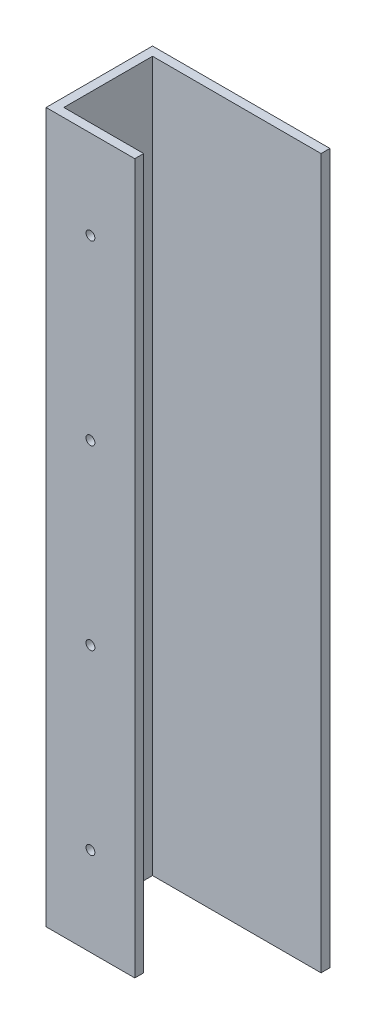
ISO-10303-21;
HEADER;
FILE_DESCRIPTION(('STEP AP214'),'2;1');
FILE_NAME('part.step','',(''),(''),'','','');
FILE_SCHEMA(('AUTOMOTIVE_DESIGN { 1 0 10303 214 1 1 1 1 }'));
ENDSEC;
DATA;
#1=APPLICATION_CONTEXT('core data for automotive mechanical design processes');
#2=APPLICATION_PROTOCOL_DEFINITION('international standard','automotive_design',2000,#1);
#3=PRODUCT_CONTEXT('',#1,'mechanical');
#4=PRODUCT('Part','Part','',(#3));
#5=PRODUCT_RELATED_PRODUCT_CATEGORY('part','',(#4));
#6=PRODUCT_DEFINITION_FORMATION('','',#4);
#7=PRODUCT_DEFINITION_CONTEXT('part definition',#1,'design');
#8=PRODUCT_DEFINITION('design','',#6,#7);
#9=PRODUCT_DEFINITION_SHAPE('','',#8);
#10=(LENGTH_UNIT() NAMED_UNIT(*) SI_UNIT(.MILLI.,.METRE.));
#11=(NAMED_UNIT(*) PLANE_ANGLE_UNIT() SI_UNIT($,.RADIAN.));
#12=(NAMED_UNIT(*) SI_UNIT($,.STERADIAN.) SOLID_ANGLE_UNIT());
#13=UNCERTAINTY_MEASURE_WITH_UNIT(LENGTH_MEASURE(1.E-05),#10,'distance_accuracy_value','');
#14=(GEOMETRIC_REPRESENTATION_CONTEXT(3) GLOBAL_UNCERTAINTY_ASSIGNED_CONTEXT((#13)) GLOBAL_UNIT_ASSIGNED_CONTEXT((#10,
#11,#12)) REPRESENTATION_CONTEXT('',''));
#15=CARTESIAN_POINT('',(0.,0.,0.));
#16=DIRECTION('',(0.,0.,1.));
#17=DIRECTION('',(1.,0.,0.));
#18=AXIS2_PLACEMENT_3D('',#15,#16,#17);
#19=CARTESIAN_POINT('',(25.,50.,55.));
#20=DIRECTION('',(0.,0.,1.));
#21=DIRECTION('',(1.,0.,0.));
#22=AXIS2_PLACEMENT_3D('',#19,#20,#21);
#23=CYLINDRICAL_SURFACE('',#22,2.5);
#24=CARTESIAN_POINT('',(25.,50.,55.));
#25=DIRECTION('',(0.,0.,1.));
#26=DIRECTION('',(1.,0.,0.));
#27=AXIS2_PLACEMENT_3D('',#24,#25,#26);
#28=CIRCLE('',#27,2.5);
#29=CARTESIAN_POINT('',(27.5,50.,55.));
#30=VERTEX_POINT('',#29);
#31=EDGE_CURVE('E20',#30,#30,#28,.T.);
#32=ORIENTED_EDGE('',*,*,#31,.F.);
#33=EDGE_LOOP('',(#32));
#34=FACE_BOUND('',#33,.T.);
#35=CARTESIAN_POINT('',(25.,50.,60.));
#36=DIRECTION('',(0.,0.,1.));
#37=DIRECTION('',(1.,0.,0.));
#38=AXIS2_PLACEMENT_3D('',#35,#36,#37);
#39=CIRCLE('',#38,2.5);
#40=CARTESIAN_POINT('',(27.5,50.,60.));
#41=VERTEX_POINT('',#40);
#42=EDGE_CURVE('E121',#41,#41,#39,.T.);
#43=ORIENTED_EDGE('',*,*,#42,.T.);
#44=EDGE_LOOP('',(#43));
#45=FACE_BOUND('',#44,.T.);
#46=ADVANCED_FACE('F17',(#34,#45),#23,.F.);
#47=CARTESIAN_POINT('',(24.9999999999997,150.,55.));
#48=DIRECTION('',(0.,0.,1.));
#49=DIRECTION('',(1.,0.,0.));
#50=AXIS2_PLACEMENT_3D('',#47,#48,#49);
#51=CYLINDRICAL_SURFACE('',#50,2.5);
#52=CARTESIAN_POINT('',(24.9999999999997,150.,55.));
#53=DIRECTION('',(0.,0.,1.));
#54=DIRECTION('',(1.,0.,0.));
#55=AXIS2_PLACEMENT_3D('',#52,#53,#54);
#56=CIRCLE('',#55,2.5);
#57=CARTESIAN_POINT('',(27.4999999999997,150.,55.));
#58=VERTEX_POINT('',#57);
#59=EDGE_CURVE('E140',#58,#58,#56,.T.);
#60=ORIENTED_EDGE('',*,*,#59,.F.);
#61=EDGE_LOOP('',(#60));
#62=FACE_BOUND('',#61,.T.);
#63=CARTESIAN_POINT('',(24.9999999999997,150.,60.));
#64=DIRECTION('',(0.,0.,1.));
#65=DIRECTION('',(1.,0.,0.));
#66=AXIS2_PLACEMENT_3D('',#63,#64,#65);
#67=CIRCLE('',#66,2.5);
#68=CARTESIAN_POINT('',(27.4999999999997,150.,60.));
#69=VERTEX_POINT('',#68);
#70=EDGE_CURVE('E131',#69,#69,#67,.T.);
#71=ORIENTED_EDGE('',*,*,#70,.T.);
#72=EDGE_LOOP('',(#71));
#73=FACE_BOUND('',#72,.T.);
#74=ADVANCED_FACE('F151',(#62,#73),#51,.F.);
#75=CARTESIAN_POINT('',(24.9999999999993,250.,55.));
#76=DIRECTION('',(0.,0.,1.));
#77=DIRECTION('',(1.,0.,0.));
#78=AXIS2_PLACEMENT_3D('',#75,#76,#77);
#79=CYLINDRICAL_SURFACE('',#78,2.5);
#80=CARTESIAN_POINT('',(24.9999999999993,250.,55.));
#81=DIRECTION('',(0.,0.,1.));
#82=DIRECTION('',(1.,0.,0.));
#83=AXIS2_PLACEMENT_3D('',#80,#81,#82);
#84=CIRCLE('',#83,2.5);
#85=CARTESIAN_POINT('',(27.4999999999993,250.,55.));
#86=VERTEX_POINT('',#85);
#87=EDGE_CURVE('E138',#86,#86,#84,.T.);
#88=ORIENTED_EDGE('',*,*,#87,.F.);
#89=EDGE_LOOP('',(#88));
#90=FACE_BOUND('',#89,.T.);
#91=CARTESIAN_POINT('',(24.9999999999993,250.,60.));
#92=DIRECTION('',(0.,0.,1.));
#93=DIRECTION('',(1.,0.,0.));
#94=AXIS2_PLACEMENT_3D('',#91,#92,#93);
#95=CIRCLE('',#94,2.5);
#96=CARTESIAN_POINT('',(27.4999999999993,250.,60.));
#97=VERTEX_POINT('',#96);
#98=EDGE_CURVE('E128',#97,#97,#95,.T.);
#99=ORIENTED_EDGE('',*,*,#98,.T.);
#100=EDGE_LOOP('',(#99));
#101=FACE_BOUND('',#100,.T.);
#102=ADVANCED_FACE('F259',(#90,#101),#79,.F.);
#103=CARTESIAN_POINT('',(24.999999999999,350.,55.));
#104=DIRECTION('',(0.,0.,1.));
#105=DIRECTION('',(1.,0.,0.));
#106=AXIS2_PLACEMENT_3D('',#103,#104,#105);
#107=CYLINDRICAL_SURFACE('',#106,2.5);
#108=CARTESIAN_POINT('',(24.999999999999,350.,55.));
#109=DIRECTION('',(0.,0.,1.));
#110=DIRECTION('',(1.,0.,0.));
#111=AXIS2_PLACEMENT_3D('',#108,#109,#110);
#112=CIRCLE('',#111,2.5);
#113=CARTESIAN_POINT('',(27.499999999999,350.,55.));
#114=VERTEX_POINT('',#113);
#115=EDGE_CURVE('E125',#114,#114,#112,.T.);
#116=ORIENTED_EDGE('',*,*,#115,.F.);
#117=EDGE_LOOP('',(#116));
#118=FACE_BOUND('',#117,.T.);
#119=CARTESIAN_POINT('',(24.999999999999,350.,60.));
#120=DIRECTION('',(0.,0.,1.));
#121=DIRECTION('',(1.,0.,0.));
#122=AXIS2_PLACEMENT_3D('',#119,#120,#121);
#123=CIRCLE('',#122,2.5);
#124=CARTESIAN_POINT('',(27.499999999999,350.,60.));
#125=VERTEX_POINT('',#124);
#126=EDGE_CURVE('E117',#125,#125,#123,.T.);
#127=ORIENTED_EDGE('',*,*,#126,.T.);
#128=EDGE_LOOP('',(#127));
#129=FACE_BOUND('',#128,.T.);
#130=ADVANCED_FACE('F250',(#118,#129),#107,.F.);
#131=CARTESIAN_POINT('',(100.,0.,55.));
#132=DIRECTION('',(0.,0.,-1.));
#133=DIRECTION('',(-1.,0.,0.));
#134=AXIS2_PLACEMENT_3D('',#131,#132,#133);
#135=PLANE('',#134);
#136=DIRECTION('',(1.,0.,0.));
#137=VECTOR('',#136,1.);
#138=CARTESIAN_POINT('',(0.,0.,55.));
#139=LINE('',#138,#137);
#140=CARTESIAN_POINT('',(50.,0.,55.));
#141=VERTEX_POINT('',#140);
#142=CARTESIAN_POINT('',(5.,0.,55.));
#143=VERTEX_POINT('',#142);
#144=EDGE_CURVE('E302',#141,#143,#139,.F.);
#145=ORIENTED_EDGE('',*,*,#144,.T.);
#146=DIRECTION('',(0.,1.,0.));
#147=VECTOR('',#146,1.);
#148=CARTESIAN_POINT('',(5.,0.,55.));
#149=LINE('',#148,#147);
#150=CARTESIAN_POINT('',(5.,400.,55.));
#151=VERTEX_POINT('',#150);
#152=EDGE_CURVE('E122',#151,#143,#149,.F.);
#153=ORIENTED_EDGE('',*,*,#152,.F.);
#154=DIRECTION('',(1.,0.,0.));
#155=VECTOR('',#154,1.);
#156=CARTESIAN_POINT('',(0.,400.,55.));
#157=LINE('',#156,#155);
#158=CARTESIAN_POINT('',(50.,400.,55.));
#159=VERTEX_POINT('',#158);
#160=EDGE_CURVE('E323',#151,#159,#157,.T.);
#161=ORIENTED_EDGE('',*,*,#160,.T.);
#162=DIRECTION('',(0.,1.,0.));
#163=VECTOR('',#162,1.);
#164=CARTESIAN_POINT('',(50.,0.,55.));
#165=LINE('',#164,#163);
#166=EDGE_CURVE('E114',#141,#159,#165,.T.);
#167=ORIENTED_EDGE('',*,*,#166,.F.);
#168=EDGE_LOOP('',(#145,#153,#161,#167));
#169=FACE_BOUND('',#168,.T.);
#170=ORIENTED_EDGE('',*,*,#115,.T.);
#171=EDGE_LOOP('',(#170));
#172=FACE_BOUND('',#171,.T.);
#173=ORIENTED_EDGE('',*,*,#87,.T.);
#174=EDGE_LOOP('',(#173));
#175=FACE_BOUND('',#174,.T.);
#176=ORIENTED_EDGE('',*,*,#59,.T.);
#177=EDGE_LOOP('',(#176));
#178=FACE_BOUND('',#177,.T.);
#179=ORIENTED_EDGE('',*,*,#31,.T.);
#180=EDGE_LOOP('',(#179));
#181=FACE_BOUND('',#180,.T.);
#182=ADVANCED_FACE('F147',(#169,#172,#175,#178,#181),#135,.T.);
#183=CARTESIAN_POINT('',(5.,0.,55.));
#184=DIRECTION('',(1.,0.,0.));
#185=DIRECTION('',(0.,0.,-1.));
#186=AXIS2_PLACEMENT_3D('',#183,#184,#185);
#187=PLANE('',#186);
#188=DIRECTION('',(0.,0.,1.));
#189=VECTOR('',#188,1.);
#190=CARTESIAN_POINT('',(5.,0.,60.));
#191=LINE('',#190,#189);
#192=CARTESIAN_POINT('',(5.,0.,5.));
#193=VERTEX_POINT('',#192);
#194=EDGE_CURVE('E307',#143,#193,#191,.F.);
#195=ORIENTED_EDGE('',*,*,#194,.T.);
#196=DIRECTION('',(0.,1.,0.));
#197=VECTOR('',#196,1.);
#198=CARTESIAN_POINT('',(5.,0.,5.));
#199=LINE('',#198,#197);
#200=CARTESIAN_POINT('',(5.,400.,5.));
#201=VERTEX_POINT('',#200);
#202=EDGE_CURVE('E118',#201,#193,#199,.F.);
#203=ORIENTED_EDGE('',*,*,#202,.F.);
#204=DIRECTION('',(0.,0.,-1.));
#205=VECTOR('',#204,1.);
#206=CARTESIAN_POINT('',(5.,400.,60.));
#207=LINE('',#206,#205);
#208=EDGE_CURVE('E109',#201,#151,#207,.F.);
#209=ORIENTED_EDGE('',*,*,#208,.T.);
#210=ORIENTED_EDGE('',*,*,#152,.T.);
#211=EDGE_LOOP('',(#195,#203,#209,#210));
#212=FACE_BOUND('',#211,.T.);
#213=ADVANCED_FACE('F165',(#212),#187,.T.);
#214=CARTESIAN_POINT('',(100.,0.,5.00000000000001));
#215=DIRECTION('',(0.,0.,1.));
#216=DIRECTION('',(1.,0.,0.));
#217=AXIS2_PLACEMENT_3D('',#214,#215,#216);
#218=PLANE('',#217);
#219=DIRECTION('',(1.,0.,0.));
#220=VECTOR('',#219,1.);
#221=CARTESIAN_POINT('',(0.,0.,5.));
#222=LINE('',#221,#220);
#223=CARTESIAN_POINT('',(100.,0.,5.00000000000001));
#224=VERTEX_POINT('',#223);
#225=EDGE_CURVE('E312',#193,#224,#222,.T.);
#226=ORIENTED_EDGE('',*,*,#225,.T.);
#227=DIRECTION('',(0.,1.,0.));
#228=VECTOR('',#227,1.);
#229=CARTESIAN_POINT('',(100.,0.,5.00000000000001));
#230=LINE('',#229,#228);
#231=CARTESIAN_POINT('',(100.,400.,5.00000000000001));
#232=VERTEX_POINT('',#231);
#233=EDGE_CURVE('E308',#224,#232,#230,.T.);
#234=ORIENTED_EDGE('',*,*,#233,.T.);
#235=DIRECTION('',(1.,0.,0.));
#236=VECTOR('',#235,1.);
#237=CARTESIAN_POINT('',(0.,400.,5.00000000000001));
#238=LINE('',#237,#236);
#239=EDGE_CURVE('E106',#232,#201,#238,.F.);
#240=ORIENTED_EDGE('',*,*,#239,.T.);
#241=ORIENTED_EDGE('',*,*,#202,.T.);
#242=EDGE_LOOP('',(#226,#234,#240,#241));
#243=FACE_BOUND('',#242,.T.);
#244=ADVANCED_FACE('F156',(#243),#218,.T.);
#245=CARTESIAN_POINT('',(0.,0.,60.));
#246=DIRECTION('',(0.,0.,-1.));
#247=DIRECTION('',(-1.,0.,0.));
#248=AXIS2_PLACEMENT_3D('',#245,#246,#247);
#249=PLANE('',#248);
#250=DIRECTION('',(1.,0.,0.));
#251=VECTOR('',#250,1.);
#252=CARTESIAN_POINT('',(0.,400.,60.));
#253=LINE('',#252,#251);
#254=CARTESIAN_POINT('',(50.,400.,60.));
#255=VERTEX_POINT('',#254);
#256=CARTESIAN_POINT('',(0.,400.,60.));
#257=VERTEX_POINT('',#256);
#258=EDGE_CURVE('E83',#255,#257,#253,.F.);
#259=ORIENTED_EDGE('',*,*,#258,.T.);
#260=DIRECTION('',(0.,1.,0.));
#261=VECTOR('',#260,1.);
#262=CARTESIAN_POINT('',(0.,0.,60.));
#263=LINE('',#262,#261);
#264=CARTESIAN_POINT('',(0.,0.,60.));
#265=VERTEX_POINT('',#264);
#266=EDGE_CURVE('E87',#257,#265,#263,.F.);
#267=ORIENTED_EDGE('',*,*,#266,.T.);
#268=DIRECTION('',(1.,0.,0.));
#269=VECTOR('',#268,1.);
#270=CARTESIAN_POINT('',(0.,0.,60.));
#271=LINE('',#270,#269);
#272=CARTESIAN_POINT('',(50.,0.,60.));
#273=VERTEX_POINT('',#272);
#274=EDGE_CURVE('E326',#265,#273,#271,.T.);
#275=ORIENTED_EDGE('',*,*,#274,.T.);
#276=DIRECTION('',(0.,1.,0.));
#277=VECTOR('',#276,1.);
#278=CARTESIAN_POINT('',(50.,0.,60.));
#279=LINE('',#278,#277);
#280=EDGE_CURVE('E80',#255,#273,#279,.F.);
#281=ORIENTED_EDGE('',*,*,#280,.F.);
#282=EDGE_LOOP('',(#259,#267,#275,#281));
#283=FACE_BOUND('',#282,.T.);
#284=ORIENTED_EDGE('',*,*,#126,.F.);
#285=EDGE_LOOP('',(#284));
#286=FACE_BOUND('',#285,.T.);
#287=ORIENTED_EDGE('',*,*,#98,.F.);
#288=EDGE_LOOP('',(#287));
#289=FACE_BOUND('',#288,.T.);
#290=ORIENTED_EDGE('',*,*,#70,.F.);
#291=EDGE_LOOP('',(#290));
#292=FACE_BOUND('',#291,.T.);
#293=ORIENTED_EDGE('',*,*,#42,.F.);
#294=EDGE_LOOP('',(#293));
#295=FACE_BOUND('',#294,.T.);
#296=ADVANCED_FACE('F85',(#283,#286,#289,#292,#295),#249,.F.);
#297=CARTESIAN_POINT('',(50.,0.,0.));
#298=DIRECTION('',(1.,0.,0.));
#299=DIRECTION('',(0.,0.,-1.));
#300=AXIS2_PLACEMENT_3D('',#297,#298,#299);
#301=PLANE('',#300);
#302=DIRECTION('',(0.,0.,-1.));
#303=VECTOR('',#302,1.);
#304=CARTESIAN_POINT('',(50.,400.,60.));
#305=LINE('',#304,#303);
#306=EDGE_CURVE('E321',#159,#255,#305,.F.);
#307=ORIENTED_EDGE('',*,*,#306,.T.);
#308=ORIENTED_EDGE('',*,*,#280,.T.);
#309=DIRECTION('',(0.,0.,1.));
#310=VECTOR('',#309,1.);
#311=CARTESIAN_POINT('',(50.,0.,60.));
#312=LINE('',#311,#310);
#313=EDGE_CURVE('E324',#273,#141,#312,.F.);
#314=ORIENTED_EDGE('',*,*,#313,.T.);
#315=ORIENTED_EDGE('',*,*,#166,.T.);
#316=EDGE_LOOP('',(#307,#308,#314,#315));
#317=FACE_BOUND('',#316,.T.);
#318=ADVANCED_FACE('F155',(#317),#301,.T.);
#319=CARTESIAN_POINT('',(0.,0.,60.));
#320=DIRECTION('',(1.,0.,0.));
#321=DIRECTION('',(0.,0.,-1.));
#322=AXIS2_PLACEMENT_3D('',#319,#320,#321);
#323=PLANE('',#322);
#324=DIRECTION('',(0.,0.,1.));
#325=VECTOR('',#324,1.);
#326=CARTESIAN_POINT('',(0.,0.,60.));
#327=LINE('',#326,#325);
#328=CARTESIAN_POINT('',(0.,0.,0.));
#329=VERTEX_POINT('',#328);
#330=EDGE_CURVE('E98',#329,#265,#327,.T.);
#331=ORIENTED_EDGE('',*,*,#330,.T.);
#332=ORIENTED_EDGE('',*,*,#266,.F.);
#333=DIRECTION('',(0.,0.,-1.));
#334=VECTOR('',#333,1.);
#335=CARTESIAN_POINT('',(0.,400.,60.));
#336=LINE('',#335,#334);
#337=CARTESIAN_POINT('',(0.,400.,0.));
#338=VERTEX_POINT('',#337);
#339=EDGE_CURVE('E92',#257,#338,#336,.T.);
#340=ORIENTED_EDGE('',*,*,#339,.T.);
#341=DIRECTION('',(0.,1.,0.));
#342=VECTOR('',#341,1.);
#343=CARTESIAN_POINT('',(0.,0.,0.));
#344=LINE('',#343,#342);
#345=EDGE_CURVE('E325',#329,#338,#344,.T.);
#346=ORIENTED_EDGE('',*,*,#345,.F.);
#347=EDGE_LOOP('',(#331,#332,#340,#346));
#348=FACE_BOUND('',#347,.T.);
#349=ADVANCED_FACE('F95',(#348),#323,.F.);
#350=CARTESIAN_POINT('',(0.,400.,60.));
#351=DIRECTION('',(0.,-1.,0.));
#352=DIRECTION('',(0.,0.,-1.));
#353=AXIS2_PLACEMENT_3D('',#350,#351,#352);
#354=PLANE('',#353);
#355=ORIENTED_EDGE('',*,*,#160,.F.);
#356=ORIENTED_EDGE('',*,*,#208,.F.);
#357=ORIENTED_EDGE('',*,*,#239,.F.);
#358=DIRECTION('',(0.,0.,1.));
#359=VECTOR('',#358,1.);
#360=CARTESIAN_POINT('',(100.,400.,60.));
#361=LINE('',#360,#359);
#362=CARTESIAN_POINT('',(100.,400.,0.));
#363=VERTEX_POINT('',#362);
#364=EDGE_CURVE('E319',#232,#363,#361,.F.);
#365=ORIENTED_EDGE('',*,*,#364,.T.);
#366=DIRECTION('',(-1.,0.,0.));
#367=VECTOR('',#366,1.);
#368=CARTESIAN_POINT('',(0.,400.,0.));
#369=LINE('',#368,#367);
#370=EDGE_CURVE('E104',#338,#363,#369,.F.);
#371=ORIENTED_EDGE('',*,*,#370,.F.);
#372=ORIENTED_EDGE('',*,*,#339,.F.);
#373=ORIENTED_EDGE('',*,*,#258,.F.);
#374=ORIENTED_EDGE('',*,*,#306,.F.);
#375=EDGE_LOOP('',(#355,#356,#357,#365,#371,#372,#373,#374));
#376=FACE_BOUND('',#375,.T.);
#377=ADVANCED_FACE('F102',(#376),#354,.F.);
#378=CARTESIAN_POINT('',(100.,0.,60.));
#379=DIRECTION('',(-1.,0.,0.));
#380=DIRECTION('',(0.,0.,1.));
#381=AXIS2_PLACEMENT_3D('',#378,#379,#380);
#382=PLANE('',#381);
#383=DIRECTION('',(0.,0.,1.));
#384=VECTOR('',#383,1.);
#385=CARTESIAN_POINT('',(100.,0.,60.));
#386=LINE('',#385,#384);
#387=CARTESIAN_POINT('',(100.,0.,0.));
#388=VERTEX_POINT('',#387);
#389=EDGE_CURVE('E35',#224,#388,#386,.F.);
#390=ORIENTED_EDGE('',*,*,#389,.T.);
#391=DIRECTION('',(0.,1.,0.));
#392=VECTOR('',#391,1.);
#393=CARTESIAN_POINT('',(100.,0.,0.));
#394=LINE('',#393,#392);
#395=EDGE_CURVE('E26',#363,#388,#394,.F.);
#396=ORIENTED_EDGE('',*,*,#395,.F.);
#397=ORIENTED_EDGE('',*,*,#364,.F.);
#398=ORIENTED_EDGE('',*,*,#233,.F.);
#399=EDGE_LOOP('',(#390,#396,#397,#398));
#400=FACE_BOUND('',#399,.T.);
#401=ADVANCED_FACE('F176',(#400),#382,.F.);
#402=CARTESIAN_POINT('',(0.,0.,60.));
#403=DIRECTION('',(0.,1.,0.));
#404=DIRECTION('',(0.,0.,1.));
#405=AXIS2_PLACEMENT_3D('',#402,#403,#404);
#406=PLANE('',#405);
#407=ORIENTED_EDGE('',*,*,#274,.F.);
#408=ORIENTED_EDGE('',*,*,#330,.F.);
#409=DIRECTION('',(-1.,0.,0.));
#410=VECTOR('',#409,1.);
#411=CARTESIAN_POINT('',(0.,0.,0.));
#412=LINE('',#411,#410);
#413=EDGE_CURVE('E11',#388,#329,#412,.T.);
#414=ORIENTED_EDGE('',*,*,#413,.F.);
#415=ORIENTED_EDGE('',*,*,#389,.F.);
#416=ORIENTED_EDGE('',*,*,#225,.F.);
#417=ORIENTED_EDGE('',*,*,#194,.F.);
#418=ORIENTED_EDGE('',*,*,#144,.F.);
#419=ORIENTED_EDGE('',*,*,#313,.F.);
#420=EDGE_LOOP('',(#407,#408,#414,#415,#416,#417,#418,#419));
#421=FACE_BOUND('',#420,.T.);
#422=ADVANCED_FACE('F170',(#421),#406,.F.);
#423=CARTESIAN_POINT('',(0.,0.,0.));
#424=DIRECTION('',(0.,0.,-1.));
#425=DIRECTION('',(-1.,0.,0.));
#426=AXIS2_PLACEMENT_3D('',#423,#424,#425);
#427=PLANE('',#426);
#428=ORIENTED_EDGE('',*,*,#395,.T.);
#429=ORIENTED_EDGE('',*,*,#413,.T.);
#430=ORIENTED_EDGE('',*,*,#345,.T.);
#431=ORIENTED_EDGE('',*,*,#370,.T.);
#432=EDGE_LOOP('',(#428,#429,#430,#431));
#433=FACE_BOUND('',#432,.T.);
#434=ADVANCED_FACE('F168',(#433),#427,.T.);
#435=CLOSED_SHELL('',(#46,#74,#102,#130,#182,#213,#244,#296,#318,#349,#377,#401,#422,#434));
#436=MANIFOLD_SOLID_BREP('B1',#435);
#437=ADVANCED_BREP_SHAPE_REPRESENTATION('',(#18,#436),#14);
#438=SHAPE_DEFINITION_REPRESENTATION(#9,#437);
ENDSEC;
END-ISO-10303-21;
